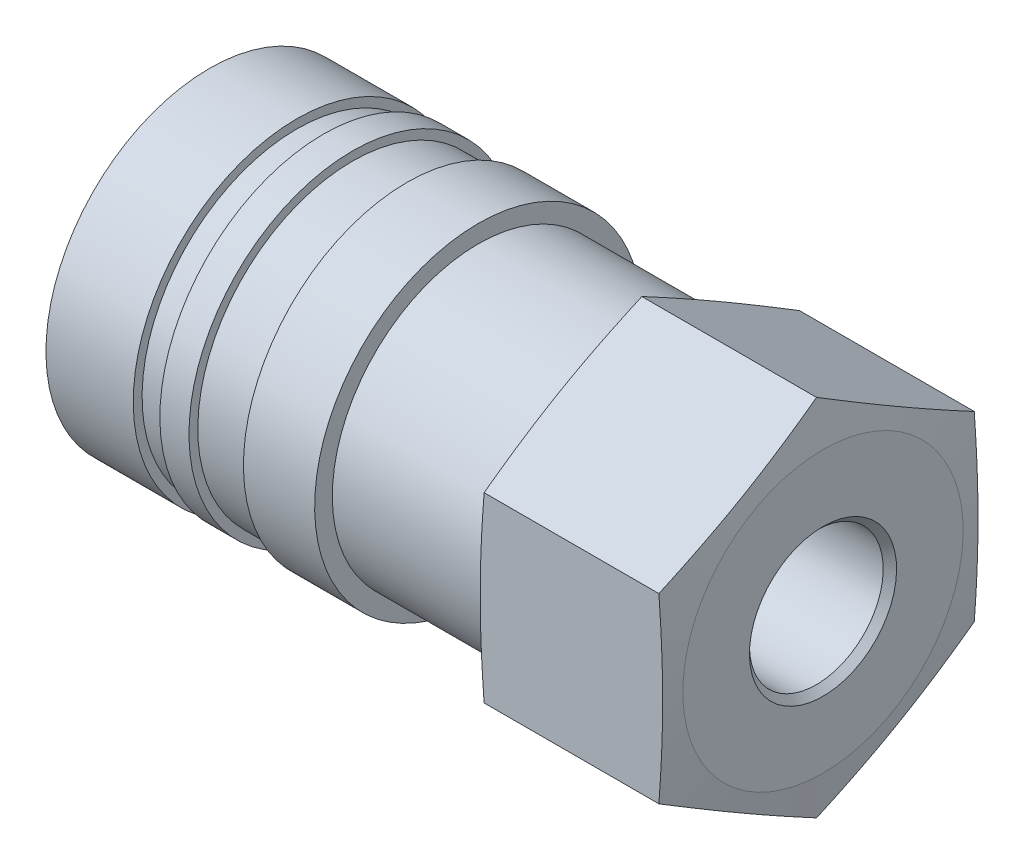
ISO-10303-21;
HEADER;
FILE_DESCRIPTION(('STEP AP214'),'2;1');
FILE_NAME('part.step','',(''),(''),'','','');
FILE_SCHEMA(('AUTOMOTIVE_DESIGN { 1 0 10303 214 1 1 1 1 }'));
ENDSEC;
DATA;
#1=APPLICATION_CONTEXT('core data for automotive mechanical design processes');
#2=APPLICATION_PROTOCOL_DEFINITION('international standard','automotive_design',2000,#1);
#3=PRODUCT_CONTEXT('',#1,'mechanical');
#4=PRODUCT('Part','Part','',(#3));
#5=PRODUCT_RELATED_PRODUCT_CATEGORY('part','',(#4));
#6=PRODUCT_DEFINITION_FORMATION('','',#4);
#7=PRODUCT_DEFINITION_CONTEXT('part definition',#1,'design');
#8=PRODUCT_DEFINITION('design','',#6,#7);
#9=PRODUCT_DEFINITION_SHAPE('','',#8);
#10=(LENGTH_UNIT() NAMED_UNIT(*) SI_UNIT(.MILLI.,.METRE.));
#11=(NAMED_UNIT(*) PLANE_ANGLE_UNIT() SI_UNIT($,.RADIAN.));
#12=(NAMED_UNIT(*) SI_UNIT($,.STERADIAN.) SOLID_ANGLE_UNIT());
#13=UNCERTAINTY_MEASURE_WITH_UNIT(LENGTH_MEASURE(1.E-05),#10,'distance_accuracy_value','');
#14=(GEOMETRIC_REPRESENTATION_CONTEXT(3) GLOBAL_UNCERTAINTY_ASSIGNED_CONTEXT((#13)) GLOBAL_UNIT_ASSIGNED_CONTEXT((#10,
#11,#12)) REPRESENTATION_CONTEXT('',''));
#15=CARTESIAN_POINT('',(0.,0.,0.));
#16=DIRECTION('',(0.,0.,1.));
#17=DIRECTION('',(1.,0.,0.));
#18=AXIS2_PLACEMENT_3D('',#15,#16,#17);
#19=CARTESIAN_POINT('',(55.,11.6913429510899,6.75));
#20=DIRECTION('',(0.,0.866025403784439,0.5));
#21=DIRECTION('',(0.,0.5,-0.866025403784439));
#22=AXIS2_PLACEMENT_3D('',#19,#20,#21);
#23=PLANE('',#22);
#24=CARTESIAN_POINT('',(37.683,6.69159295734021,15.4098210143166));
#25=CARTESIAN_POINT('',(36.7319841472304,11.6913429510899,6.75));
#26=CARTESIAN_POINT('',(37.683,16.6910929448396,-1.90982101431667));
#27=(BOUNDED_CURVE() B_SPLINE_CURVE(2,(#24,#25,#26),.UNSPECIFIED.,.F.,
.F.) B_SPLINE_CURVE_WITH_KNOTS((3,3),(0.,20.0267861610921),
.UNSPECIFIED.) CURVE() GEOMETRIC_REPRESENTATION_ITEM() RATIONAL_B_SPLINE_CURVE((1.,
1.24444444444444,1.)) REPRESENTATION_ITEM(''));
#28=CARTESIAN_POINT('',(37.4894116553188,7.79422863405995,13.5));
#29=VERTEX_POINT('',#28);
#30=CARTESIAN_POINT('',(37.4894116553188,15.5884572681199,0.));
#31=VERTEX_POINT('',#30);
#32=EDGE_CURVE('E35',#29,#31,#27,.T.);
#33=ORIENTED_EDGE('',*,*,#32,.F.);
#34=DIRECTION('',(-1.,0.,0.));
#35=VECTOR('',#34,1.);
#36=CARTESIAN_POINT('',(55.,7.79422863405995,13.5));
#37=LINE('',#36,#35);
#38=CARTESIAN_POINT('',(52.4452063113401,7.79422863405995,13.5));
#39=VERTEX_POINT('',#38);
#40=EDGE_CURVE('E193',#39,#29,#37,.T.);
#41=ORIENTED_EDGE('',*,*,#40,.F.);
#42=CARTESIAN_POINT('',(52.258,16.6910929448396,-1.90982101431667));
#43=CARTESIAN_POINT('',(53.1776636817992,11.6913429510899,6.75));
#44=CARTESIAN_POINT('',(52.258,6.69159295734021,15.4098210143166));
#45=(BOUNDED_CURVE() B_SPLINE_CURVE(2,(#42,#43,#44),.UNSPECIFIED.,.F.,
.F.) B_SPLINE_CURVE_WITH_KNOTS((3,3),(0.,20.0249854726362),
.UNSPECIFIED.) CURVE() GEOMETRIC_REPRESENTATION_ITEM() RATIONAL_B_SPLINE_CURVE((1.,
1.24444444444447,1.)) REPRESENTATION_ITEM(''));
#46=CARTESIAN_POINT('',(52.4452063113401,15.5884572681199,0.));
#47=VERTEX_POINT('',#46);
#48=EDGE_CURVE('E128',#47,#39,#45,.T.);
#49=ORIENTED_EDGE('',*,*,#48,.F.);
#50=DIRECTION('',(-1.,0.,0.));
#51=VECTOR('',#50,1.);
#52=CARTESIAN_POINT('',(55.,15.5884572681199,0.));
#53=LINE('',#52,#51);
#54=EDGE_CURVE('E9',#47,#31,#53,.T.);
#55=ORIENTED_EDGE('',*,*,#54,.T.);
#56=EDGE_LOOP('',(#33,#41,#49,#55));
#57=FACE_BOUND('',#56,.T.);
#58=ADVANCED_FACE('F15',(#57),#23,.T.);
#59=CARTESIAN_POINT('',(55.,11.6913429510899,-6.75));
#60=DIRECTION('',(0.,0.866025403784439,-0.5));
#61=DIRECTION('',(0.,-0.5,-0.866025403784439));
#62=AXIS2_PLACEMENT_3D('',#59,#60,#61);
#63=PLANE('',#62);
#64=CARTESIAN_POINT('',(37.683,16.6910929448396,1.90982101431668));
#65=CARTESIAN_POINT('',(36.7319841472304,11.6913429510899,-6.75));
#66=CARTESIAN_POINT('',(37.683,6.69159295734022,-15.4098210143166));
#67=(BOUNDED_CURVE() B_SPLINE_CURVE(2,(#64,#65,#66),.UNSPECIFIED.,.F.,
.F.) B_SPLINE_CURVE_WITH_KNOTS((3,3),(0.,20.0267861610921),
.UNSPECIFIED.) CURVE() GEOMETRIC_REPRESENTATION_ITEM() RATIONAL_B_SPLINE_CURVE((1.,
1.24444444444444,1.)) REPRESENTATION_ITEM(''));
#68=CARTESIAN_POINT('',(37.4894116553188,7.79422863405995,-13.5));
#69=VERTEX_POINT('',#68);
#70=EDGE_CURVE('E154',#31,#69,#67,.T.);
#71=ORIENTED_EDGE('',*,*,#70,.F.);
#72=ORIENTED_EDGE('',*,*,#54,.F.);
#73=CARTESIAN_POINT('',(52.258,6.69159295734021,-15.4098210143166));
#74=CARTESIAN_POINT('',(53.1776636817993,11.6913429510899,-6.74999999999998));
#75=CARTESIAN_POINT('',(52.258,16.6910929448396,1.90982101431668));
#76=(BOUNDED_CURVE() B_SPLINE_CURVE(2,(#73,#74,#75),.UNSPECIFIED.,.F.,
.F.) B_SPLINE_CURVE_WITH_KNOTS((3,3),(0.,20.0249854726362),
.UNSPECIFIED.) CURVE() GEOMETRIC_REPRESENTATION_ITEM() RATIONAL_B_SPLINE_CURVE((1.,
1.24444444444445,1.)) REPRESENTATION_ITEM(''));
#77=CARTESIAN_POINT('',(52.4452063113401,7.79422863405995,-13.5));
#78=VERTEX_POINT('',#77);
#79=EDGE_CURVE('E165',#78,#47,#76,.T.);
#80=ORIENTED_EDGE('',*,*,#79,.F.);
#81=DIRECTION('',(-1.,0.,0.));
#82=VECTOR('',#81,1.);
#83=CARTESIAN_POINT('',(55.,7.79422863405995,-13.5));
#84=LINE('',#83,#82);
#85=EDGE_CURVE('E27',#78,#69,#84,.T.);
#86=ORIENTED_EDGE('',*,*,#85,.T.);
#87=EDGE_LOOP('',(#71,#72,#80,#86));
#88=FACE_BOUND('',#87,.T.);
#89=ADVANCED_FACE('F272',(#88),#63,.T.);
#90=CARTESIAN_POINT('',(55.,0.,-13.5));
#91=DIRECTION('',(0.,0.,-1.));
#92=DIRECTION('',(0.,-1.,0.));
#93=AXIS2_PLACEMENT_3D('',#90,#91,#92);
#94=PLANE('',#93);
#95=CARTESIAN_POINT('',(37.683,9.99949998749941,-13.5));
#96=CARTESIAN_POINT('',(36.7319841472304,0.,-13.5));
#97=CARTESIAN_POINT('',(37.683,-9.99949998749941,-13.5));
#98=(BOUNDED_CURVE() B_SPLINE_CURVE(2,(#95,#96,#97),.UNSPECIFIED.,.F.,
.F.) B_SPLINE_CURVE_WITH_KNOTS((3,3),(0.,20.0267861610921),
.UNSPECIFIED.) CURVE() GEOMETRIC_REPRESENTATION_ITEM() RATIONAL_B_SPLINE_CURVE((1.,
1.24444444444444,1.)) REPRESENTATION_ITEM(''));
#99=CARTESIAN_POINT('',(37.4894116553188,-7.79422863405994,-13.5));
#100=VERTEX_POINT('',#99);
#101=EDGE_CURVE('E203',#69,#100,#98,.T.);
#102=ORIENTED_EDGE('',*,*,#101,.F.);
#103=ORIENTED_EDGE('',*,*,#85,.F.);
#104=CARTESIAN_POINT('',(52.258,-9.99949998749942,-13.5));
#105=CARTESIAN_POINT('',(53.1776636817993,0.,-13.5));
#106=CARTESIAN_POINT('',(52.258,9.99949998749942,-13.5));
#107=(BOUNDED_CURVE() B_SPLINE_CURVE(2,(#104,#105,#106),.UNSPECIFIED.,.F.,
.F.) B_SPLINE_CURVE_WITH_KNOTS((3,3),(0.,20.0249854726362),
.UNSPECIFIED.) CURVE() GEOMETRIC_REPRESENTATION_ITEM() RATIONAL_B_SPLINE_CURVE((1.,
1.24444444444445,1.)) REPRESENTATION_ITEM(''));
#108=CARTESIAN_POINT('',(52.4452063113401,-7.79422863405994,-13.5));
#109=VERTEX_POINT('',#108);
#110=EDGE_CURVE('E109',#109,#78,#107,.T.);
#111=ORIENTED_EDGE('',*,*,#110,.F.);
#112=DIRECTION('',(-1.,0.,0.));
#113=VECTOR('',#112,1.);
#114=CARTESIAN_POINT('',(55.,-7.79422863405994,-13.5));
#115=LINE('',#114,#113);
#116=EDGE_CURVE('E104',#109,#100,#115,.T.);
#117=ORIENTED_EDGE('',*,*,#116,.T.);
#118=EDGE_LOOP('',(#102,#103,#111,#117));
#119=FACE_BOUND('',#118,.T.);
#120=ADVANCED_FACE('F269',(#119),#94,.T.);
#121=CARTESIAN_POINT('',(55.,-11.6913429510899,-6.75));
#122=DIRECTION('',(0.,-0.866025403784439,-0.5));
#123=DIRECTION('',(0.,-0.5,0.866025403784439));
#124=AXIS2_PLACEMENT_3D('',#121,#122,#123);
#125=PLANE('',#124);
#126=CARTESIAN_POINT('',(37.683,-6.6915929573402,-15.4098210143167));
#127=CARTESIAN_POINT('',(36.7319841472304,-11.6913429510899,-6.75));
#128=CARTESIAN_POINT('',(37.683,-16.6910929448396,1.90982101431667));
#129=(BOUNDED_CURVE() B_SPLINE_CURVE(2,(#126,#127,#128),.UNSPECIFIED.,.F.,
.F.) B_SPLINE_CURVE_WITH_KNOTS((3,3),(0.,20.0267861610922),
.UNSPECIFIED.) CURVE() GEOMETRIC_REPRESENTATION_ITEM() RATIONAL_B_SPLINE_CURVE((1.,
1.24444444444444,1.)) REPRESENTATION_ITEM(''));
#130=CARTESIAN_POINT('',(37.4894116553188,-15.5884572681199,0.));
#131=VERTEX_POINT('',#130);
#132=EDGE_CURVE('E147',#100,#131,#129,.T.);
#133=ORIENTED_EDGE('',*,*,#132,.F.);
#134=ORIENTED_EDGE('',*,*,#116,.F.);
#135=CARTESIAN_POINT('',(52.258,-16.6910929448396,1.90982101431667));
#136=CARTESIAN_POINT('',(53.1776636817993,-11.6913429510899,-6.74999999999998));
#137=CARTESIAN_POINT('',(52.258,-6.6915929573402,-15.4098210143167));
#138=(BOUNDED_CURVE() B_SPLINE_CURVE(2,(#135,#136,#137),.UNSPECIFIED.,.F.,
.F.) B_SPLINE_CURVE_WITH_KNOTS((3,3),(0.,20.0249854726362),
.UNSPECIFIED.) CURVE() GEOMETRIC_REPRESENTATION_ITEM() RATIONAL_B_SPLINE_CURVE((1.,
1.24444444444445,1.)) REPRESENTATION_ITEM(''));
#139=CARTESIAN_POINT('',(52.4452063113401,-15.5884572681199,0.));
#140=VERTEX_POINT('',#139);
#141=EDGE_CURVE('E97',#140,#109,#138,.T.);
#142=ORIENTED_EDGE('',*,*,#141,.F.);
#143=DIRECTION('',(-1.,0.,0.));
#144=VECTOR('',#143,1.);
#145=CARTESIAN_POINT('',(55.,-15.5884572681199,0.));
#146=LINE('',#145,#144);
#147=EDGE_CURVE('E101',#140,#131,#146,.T.);
#148=ORIENTED_EDGE('',*,*,#147,.T.);
#149=EDGE_LOOP('',(#133,#134,#142,#148));
#150=FACE_BOUND('',#149,.T.);
#151=ADVANCED_FACE('F100',(#150),#125,.T.);
#152=CARTESIAN_POINT('',(55.,-11.6913429510899,6.75));
#153=DIRECTION('',(0.,-0.866025403784439,0.5));
#154=DIRECTION('',(0.,0.5,0.866025403784439));
#155=AXIS2_PLACEMENT_3D('',#152,#153,#154);
#156=PLANE('',#155);
#157=CARTESIAN_POINT('',(37.683,-16.6910929448396,-1.90982101431668));
#158=CARTESIAN_POINT('',(36.7319841472304,-11.6913429510899,6.75));
#159=CARTESIAN_POINT('',(37.683,-6.69159295734022,15.4098210143166));
#160=(BOUNDED_CURVE() B_SPLINE_CURVE(2,(#157,#158,#159),.UNSPECIFIED.,.F.,
.F.) B_SPLINE_CURVE_WITH_KNOTS((3,3),(0.,20.0267861610921),
.UNSPECIFIED.) CURVE() GEOMETRIC_REPRESENTATION_ITEM() RATIONAL_B_SPLINE_CURVE((1.,
1.24444444444444,1.)) REPRESENTATION_ITEM(''));
#161=CARTESIAN_POINT('',(37.4894116553188,-7.79422863405996,13.5));
#162=VERTEX_POINT('',#161);
#163=EDGE_CURVE('E118',#131,#162,#160,.T.);
#164=ORIENTED_EDGE('',*,*,#163,.F.);
#165=ORIENTED_EDGE('',*,*,#147,.F.);
#166=CARTESIAN_POINT('',(52.258,-6.69159295734022,15.4098210143166));
#167=CARTESIAN_POINT('',(53.1776636817992,-11.6913429510899,6.74999999999999));
#168=CARTESIAN_POINT('',(52.258,-16.6910929448396,-1.90982101431668));
#169=(BOUNDED_CURVE() B_SPLINE_CURVE(2,(#166,#167,#168),.UNSPECIFIED.,.F.,
.F.) B_SPLINE_CURVE_WITH_KNOTS((3,3),(0.,20.0249854726362),
.UNSPECIFIED.) CURVE() GEOMETRIC_REPRESENTATION_ITEM() RATIONAL_B_SPLINE_CURVE((1.,
1.24444444444447,1.)) REPRESENTATION_ITEM(''));
#170=CARTESIAN_POINT('',(52.4452063113401,-7.79422863405996,13.5));
#171=VERTEX_POINT('',#170);
#172=EDGE_CURVE('E115',#171,#140,#169,.T.);
#173=ORIENTED_EDGE('',*,*,#172,.F.);
#174=DIRECTION('',(-1.,0.,0.));
#175=VECTOR('',#174,1.);
#176=CARTESIAN_POINT('',(55.,-7.79422863405996,13.5));
#177=LINE('',#176,#175);
#178=EDGE_CURVE('E119',#171,#162,#177,.T.);
#179=ORIENTED_EDGE('',*,*,#178,.T.);
#180=EDGE_LOOP('',(#164,#165,#173,#179));
#181=FACE_BOUND('',#180,.T.);
#182=ADVANCED_FACE('F113',(#181),#156,.T.);
#183=CARTESIAN_POINT('',(55.,0.,13.5));
#184=DIRECTION('',(0.,0.,1.));
#185=DIRECTION('',(0.,1.,0.));
#186=AXIS2_PLACEMENT_3D('',#183,#184,#185);
#187=PLANE('',#186);
#188=CARTESIAN_POINT('',(37.683,-9.99949998749942,13.5));
#189=CARTESIAN_POINT('',(36.7319841472304,0.,13.5));
#190=CARTESIAN_POINT('',(37.683,9.99949998749942,13.5));
#191=(BOUNDED_CURVE() B_SPLINE_CURVE(2,(#188,#189,#190),.UNSPECIFIED.,.F.,
.F.) B_SPLINE_CURVE_WITH_KNOTS((3,3),(0.,20.0267861610922),
.UNSPECIFIED.) CURVE() GEOMETRIC_REPRESENTATION_ITEM() RATIONAL_B_SPLINE_CURVE((1.,
1.24444444444444,1.)) REPRESENTATION_ITEM(''));
#192=EDGE_CURVE('E19',#162,#29,#191,.T.);
#193=ORIENTED_EDGE('',*,*,#192,.F.);
#194=ORIENTED_EDGE('',*,*,#178,.F.);
#195=CARTESIAN_POINT('',(52.258,9.99949998749942,13.5));
#196=CARTESIAN_POINT('',(53.1776636817992,0.,13.5));
#197=CARTESIAN_POINT('',(52.258,-9.99949998749942,13.5));
#198=(BOUNDED_CURVE() B_SPLINE_CURVE(2,(#195,#196,#197),.UNSPECIFIED.,.F.,
.F.) B_SPLINE_CURVE_WITH_KNOTS((3,3),(0.,20.0249854726362),
.UNSPECIFIED.) CURVE() GEOMETRIC_REPRESENTATION_ITEM() RATIONAL_B_SPLINE_CURVE((1.,
1.24444444444447,1.)) REPRESENTATION_ITEM(''));
#199=EDGE_CURVE('E125',#39,#171,#198,.T.);
#200=ORIENTED_EDGE('',*,*,#199,.F.);
#201=ORIENTED_EDGE('',*,*,#40,.T.);
#202=EDGE_LOOP('',(#193,#194,#200,#201));
#203=FACE_BOUND('',#202,.T.);
#204=ADVANCED_FACE('F302',(#203),#187,.T.);
#205=CARTESIAN_POINT('',(52.71375,0.,0.));
#206=DIRECTION('',(1.,0.,0.));
#207=DIRECTION('',(0.,1.,0.));
#208=AXIS2_PLACEMENT_3D('',#205,#206,#207);
#209=CONICAL_SURFACE('',#208,6.01125,0.785398163397448);
#210=CARTESIAN_POINT('',(52.4275,0.,0.));
#211=DIRECTION('',(1.,0.,0.));
#212=DIRECTION('',(0.,0.,1.));
#213=AXIS2_PLACEMENT_3D('',#210,#211,#212);
#214=CIRCLE('',#213,5.725);
#215=CARTESIAN_POINT('',(52.4275,5.725,0.));
#216=VERTEX_POINT('',#215);
#217=EDGE_CURVE('E182',#216,#216,#214,.T.);
#218=ORIENTED_EDGE('',*,*,#217,.F.);
#219=EDGE_LOOP('',(#218));
#220=FACE_BOUND('',#219,.T.);
#221=CARTESIAN_POINT('',(53.,0.,0.));
#222=DIRECTION('',(-1.,0.,0.));
#223=DIRECTION('',(0.,1.,0.));
#224=AXIS2_PLACEMENT_3D('',#221,#222,#223);
#225=CIRCLE('',#224,6.2975);
#226=CARTESIAN_POINT('',(53.,6.2975,0.));
#227=VERTEX_POINT('',#226);
#228=EDGE_CURVE('E126',#227,#227,#225,.T.);
#229=ORIENTED_EDGE('',*,*,#228,.F.);
#230=EDGE_LOOP('',(#229));
#231=FACE_BOUND('',#230,.T.);
#232=ADVANCED_FACE('F304',(#220,#231),#209,.F.);
#233=CARTESIAN_POINT('',(0.35,0.,0.));
#234=DIRECTION('',(-1.,0.,0.));
#235=DIRECTION('',(0.,1.,0.));
#236=AXIS2_PLACEMENT_3D('',#233,#234,#235);
#237=CONICAL_SURFACE('',#236,10.15,0.785398163397448);
#238=CARTESIAN_POINT('',(0.7,0.,0.));
#239=DIRECTION('',(-1.,0.,0.));
#240=DIRECTION('',(0.,0.,-1.));
#241=AXIS2_PLACEMENT_3D('',#238,#239,#240);
#242=CIRCLE('',#241,9.8);
#243=CARTESIAN_POINT('',(0.7,9.8,0.));
#244=VERTEX_POINT('',#243);
#245=EDGE_CURVE('E190',#244,#244,#242,.T.);
#246=ORIENTED_EDGE('',*,*,#245,.F.);
#247=EDGE_LOOP('',(#246));
#248=FACE_BOUND('',#247,.T.);
#249=CARTESIAN_POINT('',(0.,0.,0.));
#250=DIRECTION('',(1.,0.,0.));
#251=DIRECTION('',(0.,1.,0.));
#252=AXIS2_PLACEMENT_3D('',#249,#250,#251);
#253=CIRCLE('',#252,10.5);
#254=CARTESIAN_POINT('',(0.,10.5,0.));
#255=VERTEX_POINT('',#254);
#256=EDGE_CURVE('E142',#255,#255,#253,.T.);
#257=ORIENTED_EDGE('',*,*,#256,.F.);
#258=EDGE_LOOP('',(#257));
#259=FACE_BOUND('',#258,.T.);
#260=ADVANCED_FACE('F17',(#248,#259),#237,.F.);
#261=CARTESIAN_POINT('',(6.125,0.,0.));
#262=DIRECTION('',(-1.,0.,0.));
#263=DIRECTION('',(0.,0.,-1.));
#264=AXIS2_PLACEMENT_3D('',#261,#262,#263);
#265=CYLINDRICAL_SURFACE('',#264,9.8);
#266=ORIENTED_EDGE('',*,*,#245,.T.);
#267=EDGE_LOOP('',(#266));
#268=FACE_BOUND('',#267,.T.);
#269=CARTESIAN_POINT('',(13.25,0.,0.));
#270=DIRECTION('',(1.,0.,0.));
#271=DIRECTION('',(0.,0.,-1.));
#272=AXIS2_PLACEMENT_3D('',#269,#270,#271);
#273=CIRCLE('',#272,9.8);
#274=CARTESIAN_POINT('',(13.25,0.,-9.8));
#275=VERTEX_POINT('',#274);
#276=EDGE_CURVE('E188',#275,#275,#273,.T.);
#277=ORIENTED_EDGE('',*,*,#276,.T.);
#278=EDGE_LOOP('',(#277));
#279=FACE_BOUND('',#278,.T.);
#280=ADVANCED_FACE('F381',(#268,#279),#265,.F.);
#281=CARTESIAN_POINT('',(13.25,0.,0.));
#282=DIRECTION('',(1.,0.,0.));
#283=DIRECTION('',(0.,0.,-1.));
#284=AXIS2_PLACEMENT_3D('',#281,#282,#283);
#285=PLANE('',#284);
#286=ORIENTED_EDGE('',*,*,#276,.F.);
#287=EDGE_LOOP('',(#286));
#288=FACE_BOUND('',#287,.T.);
#289=ADVANCED_FACE('F386',(#288),#285,.F.);
#290=CARTESIAN_POINT('',(45.55,0.,0.));
#291=DIRECTION('',(1.,0.,0.));
#292=DIRECTION('',(0.,0.,1.));
#293=AXIS2_PLACEMENT_3D('',#290,#291,#292);
#294=CYLINDRICAL_SURFACE('',#293,5.725);
#295=ORIENTED_EDGE('',*,*,#217,.T.);
#296=EDGE_LOOP('',(#295));
#297=FACE_BOUND('',#296,.T.);
#298=CARTESIAN_POINT('',(37.1,0.,0.));
#299=DIRECTION('',(-1.,0.,0.));
#300=DIRECTION('',(0.,0.,1.));
#301=AXIS2_PLACEMENT_3D('',#298,#299,#300);
#302=CIRCLE('',#301,5.725);
#303=CARTESIAN_POINT('',(37.1,0.,5.725));
#304=VERTEX_POINT('',#303);
#305=EDGE_CURVE('E189',#304,#304,#302,.T.);
#306=ORIENTED_EDGE('',*,*,#305,.T.);
#307=EDGE_LOOP('',(#306));
#308=FACE_BOUND('',#307,.T.);
#309=ADVANCED_FACE('F392',(#297,#308),#294,.F.);
#310=CARTESIAN_POINT('',(37.1,0.,0.));
#311=DIRECTION('',(-1.,0.,0.));
#312=DIRECTION('',(0.,0.,1.));
#313=AXIS2_PLACEMENT_3D('',#310,#311,#312);
#314=PLANE('',#313);
#315=ORIENTED_EDGE('',*,*,#305,.F.);
#316=EDGE_LOOP('',(#315));
#317=FACE_BOUND('',#316,.T.);
#318=ADVANCED_FACE('F397',(#317),#314,.F.);
#319=CARTESIAN_POINT('',(15.052,0.,0.));
#320=DIRECTION('',(-1.,0.,0.));
#321=DIRECTION('',(0.,1.,0.));
#322=AXIS2_PLACEMENT_3D('',#319,#320,#321);
#323=CYLINDRICAL_SURFACE('',#322,13.244);
#324=CARTESIAN_POINT('',(17.384,0.,0.));
#325=DIRECTION('',(1.,0.,0.));
#326=DIRECTION('',(0.,1.,0.));
#327=AXIS2_PLACEMENT_3D('',#324,#325,#326);
#328=CIRCLE('',#327,13.244);
#329=CARTESIAN_POINT('',(17.384,13.244,0.));
#330=VERTEX_POINT('',#329);
#331=EDGE_CURVE('E176',#330,#330,#328,.T.);
#332=ORIENTED_EDGE('',*,*,#331,.F.);
#333=EDGE_LOOP('',(#332));
#334=FACE_BOUND('',#333,.T.);
#335=CARTESIAN_POINT('',(12.72,0.,0.));
#336=DIRECTION('',(1.,0.,0.));
#337=DIRECTION('',(0.,1.,0.));
#338=AXIS2_PLACEMENT_3D('',#335,#336,#337);
#339=CIRCLE('',#338,13.244);
#340=CARTESIAN_POINT('',(12.72,13.244,0.));
#341=VERTEX_POINT('',#340);
#342=EDGE_CURVE('E214',#341,#341,#339,.T.);
#343=ORIENTED_EDGE('',*,*,#342,.T.);
#344=EDGE_LOOP('',(#343));
#345=FACE_BOUND('',#344,.T.);
#346=ADVANCED_FACE('F323',(#334,#345),#323,.T.);
#347=CARTESIAN_POINT('',(17.384,13.622,0.));
#348=DIRECTION('',(-1.,0.,0.));
#349=DIRECTION('',(0.,-1.,0.));
#350=AXIS2_PLACEMENT_3D('',#347,#348,#349);
#351=PLANE('',#350);
#352=CARTESIAN_POINT('',(17.384,0.,0.));
#353=DIRECTION('',(1.,0.,0.));
#354=DIRECTION('',(0.,1.,0.));
#355=AXIS2_PLACEMENT_3D('',#352,#353,#354);
#356=CIRCLE('',#355,14.);
#357=CARTESIAN_POINT('',(17.384,14.,0.));
#358=VERTEX_POINT('',#357);
#359=EDGE_CURVE('E170',#358,#358,#356,.T.);
#360=ORIENTED_EDGE('',*,*,#359,.F.);
#361=EDGE_LOOP('',(#360));
#362=FACE_BOUND('',#361,.T.);
#363=ORIENTED_EDGE('',*,*,#331,.T.);
#364=EDGE_LOOP('',(#363));
#365=FACE_BOUND('',#364,.T.);
#366=ADVANCED_FACE('F339',(#362,#365),#351,.T.);
#367=CARTESIAN_POINT('',(20.4315,0.,0.));
#368=DIRECTION('',(-1.,0.,0.));
#369=DIRECTION('',(0.,1.,0.));
#370=AXIS2_PLACEMENT_3D('',#367,#368,#369);
#371=CYLINDRICAL_SURFACE('',#370,14.);
#372=CARTESIAN_POINT('',(23.479,0.,0.));
#373=DIRECTION('',(1.,0.,0.));
#374=DIRECTION('',(0.,1.,0.));
#375=AXIS2_PLACEMENT_3D('',#372,#373,#374);
#376=CIRCLE('',#375,14.);
#377=CARTESIAN_POINT('',(23.479,14.,0.));
#378=VERTEX_POINT('',#377);
#379=EDGE_CURVE('E177',#378,#378,#376,.T.);
#380=ORIENTED_EDGE('',*,*,#379,.F.);
#381=EDGE_LOOP('',(#380));
#382=FACE_BOUND('',#381,.T.);
#383=ORIENTED_EDGE('',*,*,#359,.T.);
#384=EDGE_LOOP('',(#383));
#385=FACE_BOUND('',#384,.T.);
#386=ADVANCED_FACE('F335',(#382,#385),#371,.T.);
#387=CARTESIAN_POINT('',(23.479,13.244,0.));
#388=DIRECTION('',(1.,0.,0.));
#389=DIRECTION('',(0.,1.,0.));
#390=AXIS2_PLACEMENT_3D('',#387,#388,#389);
#391=PLANE('',#390);
#392=CARTESIAN_POINT('',(23.479,0.,0.));
#393=DIRECTION('',(1.,0.,0.));
#394=DIRECTION('',(0.,1.,0.));
#395=AXIS2_PLACEMENT_3D('',#392,#393,#394);
#396=CIRCLE('',#395,12.488);
#397=CARTESIAN_POINT('',(23.479,12.488,0.));
#398=VERTEX_POINT('',#397);
#399=EDGE_CURVE('E181',#398,#398,#396,.T.);
#400=ORIENTED_EDGE('',*,*,#399,.F.);
#401=EDGE_LOOP('',(#400));
#402=FACE_BOUND('',#401,.T.);
#403=ORIENTED_EDGE('',*,*,#379,.T.);
#404=EDGE_LOOP('',(#403));
#405=FACE_BOUND('',#404,.T.);
#406=ADVANCED_FACE('F338',(#402,#405),#391,.T.);
#407=CARTESIAN_POINT('',(30.2365,0.,0.));
#408=DIRECTION('',(-1.,0.,0.));
#409=DIRECTION('',(0.,1.,0.));
#410=AXIS2_PLACEMENT_3D('',#407,#408,#409);
#411=CYLINDRICAL_SURFACE('',#410,12.488);
#412=CARTESIAN_POINT('',(36.994,0.,0.));
#413=DIRECTION('',(1.,0.,0.));
#414=DIRECTION('',(0.,1.,0.));
#415=AXIS2_PLACEMENT_3D('',#412,#413,#414);
#416=CIRCLE('',#415,12.488);
#417=CARTESIAN_POINT('',(36.994,12.488,0.));
#418=VERTEX_POINT('',#417);
#419=EDGE_CURVE('E108',#418,#418,#416,.T.);
#420=ORIENTED_EDGE('',*,*,#419,.F.);
#421=EDGE_LOOP('',(#420));
#422=FACE_BOUND('',#421,.T.);
#423=ORIENTED_EDGE('',*,*,#399,.T.);
#424=EDGE_LOOP('',(#423));
#425=FACE_BOUND('',#424,.T.);
#426=ADVANCED_FACE('F405',(#422,#425),#411,.T.);
#427=CARTESIAN_POINT('',(37.3385,0.,0.));
#428=DIRECTION('',(1.,0.,0.));
#429=DIRECTION('',(0.,1.,0.));
#430=AXIS2_PLACEMENT_3D('',#427,#428,#429);
#431=CONICAL_SURFACE('',#430,14.644,1.41234910397016);
#432=ORIENTED_EDGE('',*,*,#132,.T.);
#433=ORIENTED_EDGE('',*,*,#163,.T.);
#434=ORIENTED_EDGE('',*,*,#192,.T.);
#435=ORIENTED_EDGE('',*,*,#32,.T.);
#436=ORIENTED_EDGE('',*,*,#70,.T.);
#437=ORIENTED_EDGE('',*,*,#101,.T.);
#438=EDGE_LOOP('',(#432,#433,#434,#435,#436,#437));
#439=FACE_BOUND('',#438,.T.);
#440=ORIENTED_EDGE('',*,*,#419,.T.);
#441=EDGE_LOOP('',(#440));
#442=FACE_BOUND('',#441,.T.);
#443=ADVANCED_FACE('F298',(#439,#442),#431,.T.);
#444=CARTESIAN_POINT('',(52.629,0.,0.));
#445=DIRECTION('',(-1.,0.,0.));
#446=DIRECTION('',(0.,1.,0.));
#447=AXIS2_PLACEMENT_3D('',#444,#445,#446);
#448=CONICAL_SURFACE('',#447,14.399,1.41748982434309);
#449=ORIENTED_EDGE('',*,*,#141,.T.);
#450=ORIENTED_EDGE('',*,*,#110,.T.);
#451=ORIENTED_EDGE('',*,*,#79,.T.);
#452=ORIENTED_EDGE('',*,*,#48,.T.);
#453=ORIENTED_EDGE('',*,*,#199,.T.);
#454=ORIENTED_EDGE('',*,*,#172,.T.);
#455=EDGE_LOOP('',(#449,#450,#451,#452,#453,#454));
#456=FACE_BOUND('',#455,.T.);
#457=CARTESIAN_POINT('',(53.,0.,0.));
#458=DIRECTION('',(1.,0.,0.));
#459=DIRECTION('',(0.,1.,0.));
#460=AXIS2_PLACEMENT_3D('',#457,#458,#459);
#461=CIRCLE('',#460,11.998);
#462=CARTESIAN_POINT('',(53.,11.998,0.));
#463=VERTEX_POINT('',#462);
#464=EDGE_CURVE('E131',#463,#463,#461,.T.);
#465=ORIENTED_EDGE('',*,*,#464,.F.);
#466=EDGE_LOOP('',(#465));
#467=FACE_BOUND('',#466,.T.);
#468=ADVANCED_FACE('F122',(#456,#467),#448,.T.);
#469=CARTESIAN_POINT('',(53.,5.999,0.));
#470=DIRECTION('',(1.,0.,0.));
#471=DIRECTION('',(0.,1.,0.));
#472=AXIS2_PLACEMENT_3D('',#469,#470,#471);
#473=PLANE('',#472);
#474=ORIENTED_EDGE('',*,*,#228,.T.);
#475=EDGE_LOOP('',(#474));
#476=FACE_BOUND('',#475,.T.);
#477=ORIENTED_EDGE('',*,*,#464,.T.);
#478=EDGE_LOOP('',(#477));
#479=FACE_BOUND('',#478,.T.);
#480=ADVANCED_FACE('F328',(#476,#479),#473,.T.);
#481=CARTESIAN_POINT('',(0.,6.622,0.));
#482=DIRECTION('',(-1.,0.,0.));
#483=DIRECTION('',(0.,-1.,0.));
#484=AXIS2_PLACEMENT_3D('',#481,#482,#483);
#485=PLANE('',#484);
#486=ORIENTED_EDGE('',*,*,#256,.T.);
#487=EDGE_LOOP('',(#486));
#488=FACE_BOUND('',#487,.T.);
#489=CARTESIAN_POINT('',(0.,0.,0.));
#490=DIRECTION('',(1.,0.,0.));
#491=DIRECTION('',(0.,1.,0.));
#492=AXIS2_PLACEMENT_3D('',#489,#490,#491);
#493=CIRCLE('',#492,13.244);
#494=CARTESIAN_POINT('',(0.,13.244,0.));
#495=VERTEX_POINT('',#494);
#496=EDGE_CURVE('E136',#495,#495,#493,.T.);
#497=ORIENTED_EDGE('',*,*,#496,.F.);
#498=EDGE_LOOP('',(#497));
#499=FACE_BOUND('',#498,.T.);
#500=ADVANCED_FACE('F343',(#488,#499),#485,.T.);
#501=CARTESIAN_POINT('',(0.2385,0.,0.));
#502=DIRECTION('',(1.,0.,0.));
#503=DIRECTION('',(0.,1.,0.));
#504=AXIS2_PLACEMENT_3D('',#501,#502,#503);
#505=CONICAL_SURFACE('',#504,13.622,1.00792809394679);
#506=CARTESIAN_POINT('',(0.477,0.,0.));
#507=DIRECTION('',(1.,0.,0.));
#508=DIRECTION('',(0.,1.,0.));
#509=AXIS2_PLACEMENT_3D('',#506,#507,#508);
#510=CIRCLE('',#509,14.);
#511=CARTESIAN_POINT('',(0.477,14.,0.));
#512=VERTEX_POINT('',#511);
#513=EDGE_CURVE('E143',#512,#512,#510,.T.);
#514=ORIENTED_EDGE('',*,*,#513,.F.);
#515=EDGE_LOOP('',(#514));
#516=FACE_BOUND('',#515,.T.);
#517=ORIENTED_EDGE('',*,*,#496,.T.);
#518=EDGE_LOOP('',(#517));
#519=FACE_BOUND('',#518,.T.);
#520=ADVANCED_FACE('F348',(#516,#519),#505,.T.);
#521=CARTESIAN_POINT('',(4.2135,0.,0.));
#522=DIRECTION('',(-1.,0.,0.));
#523=DIRECTION('',(0.,1.,0.));
#524=AXIS2_PLACEMENT_3D('',#521,#522,#523);
#525=CYLINDRICAL_SURFACE('',#524,14.);
#526=CARTESIAN_POINT('',(7.95,0.,0.));
#527=DIRECTION('',(1.,0.,0.));
#528=DIRECTION('',(0.,1.,0.));
#529=AXIS2_PLACEMENT_3D('',#526,#527,#528);
#530=CIRCLE('',#529,14.);
#531=CARTESIAN_POINT('',(7.95,14.,0.));
#532=VERTEX_POINT('',#531);
#533=EDGE_CURVE('E163',#532,#532,#530,.T.);
#534=ORIENTED_EDGE('',*,*,#533,.F.);
#535=EDGE_LOOP('',(#534));
#536=FACE_BOUND('',#535,.T.);
#537=ORIENTED_EDGE('',*,*,#513,.T.);
#538=EDGE_LOOP('',(#537));
#539=FACE_BOUND('',#538,.T.);
#540=ADVANCED_FACE('F333',(#536,#539),#525,.T.);
#541=CARTESIAN_POINT('',(7.95,13.622,0.));
#542=DIRECTION('',(1.,0.,0.));
#543=DIRECTION('',(0.,1.,0.));
#544=AXIS2_PLACEMENT_3D('',#541,#542,#543);
#545=PLANE('',#544);
#546=CARTESIAN_POINT('',(7.95,0.,0.));
#547=DIRECTION('',(1.,0.,0.));
#548=DIRECTION('',(0.,1.,0.));
#549=AXIS2_PLACEMENT_3D('',#546,#547,#548);
#550=CIRCLE('',#549,13.244);
#551=CARTESIAN_POINT('',(7.95,13.244,0.));
#552=VERTEX_POINT('',#551);
#553=EDGE_CURVE('E160',#552,#552,#550,.T.);
#554=ORIENTED_EDGE('',*,*,#553,.F.);
#555=EDGE_LOOP('',(#554));
#556=FACE_BOUND('',#555,.T.);
#557=ORIENTED_EDGE('',*,*,#533,.T.);
#558=EDGE_LOOP('',(#557));
#559=FACE_BOUND('',#558,.T.);
#560=ADVANCED_FACE('F329',(#556,#559),#545,.T.);
#561=CARTESIAN_POINT('',(9.0895,0.,0.));
#562=DIRECTION('',(-1.,0.,0.));
#563=DIRECTION('',(0.,1.,0.));
#564=AXIS2_PLACEMENT_3D('',#561,#562,#563);
#565=CYLINDRICAL_SURFACE('',#564,13.244);
#566=CARTESIAN_POINT('',(10.229,0.,0.));
#567=DIRECTION('',(1.,0.,0.));
#568=DIRECTION('',(0.,1.,0.));
#569=AXIS2_PLACEMENT_3D('',#566,#567,#568);
#570=CIRCLE('',#569,13.244);
#571=CARTESIAN_POINT('',(10.229,13.244,0.));
#572=VERTEX_POINT('',#571);
#573=EDGE_CURVE('E164',#572,#572,#570,.T.);
#574=ORIENTED_EDGE('',*,*,#573,.F.);
#575=EDGE_LOOP('',(#574));
#576=FACE_BOUND('',#575,.T.);
#577=ORIENTED_EDGE('',*,*,#553,.T.);
#578=EDGE_LOOP('',(#577));
#579=FACE_BOUND('',#578,.T.);
#580=ADVANCED_FACE('F332',(#576,#579),#565,.T.);
#581=CARTESIAN_POINT('',(10.229,13.622,0.));
#582=DIRECTION('',(-1.,0.,0.));
#583=DIRECTION('',(0.,-1.,0.));
#584=AXIS2_PLACEMENT_3D('',#581,#582,#583);
#585=PLANE('',#584);
#586=CARTESIAN_POINT('',(10.229,0.,0.));
#587=DIRECTION('',(1.,0.,0.));
#588=DIRECTION('',(0.,1.,0.));
#589=AXIS2_PLACEMENT_3D('',#586,#587,#588);
#590=CIRCLE('',#589,14.);
#591=CARTESIAN_POINT('',(10.229,14.,0.));
#592=VERTEX_POINT('',#591);
#593=EDGE_CURVE('E198',#592,#592,#590,.T.);
#594=ORIENTED_EDGE('',*,*,#593,.F.);
#595=EDGE_LOOP('',(#594));
#596=FACE_BOUND('',#595,.T.);
#597=ORIENTED_EDGE('',*,*,#573,.T.);
#598=EDGE_LOOP('',(#597));
#599=FACE_BOUND('',#598,.T.);
#600=ADVANCED_FACE('F353',(#596,#599),#585,.T.);
#601=CARTESIAN_POINT('',(11.4745,0.,0.));
#602=DIRECTION('',(-1.,0.,0.));
#603=DIRECTION('',(0.,1.,0.));
#604=AXIS2_PLACEMENT_3D('',#601,#602,#603);
#605=CYLINDRICAL_SURFACE('',#604,14.);
#606=CARTESIAN_POINT('',(12.72,0.,0.));
#607=DIRECTION('',(1.,0.,0.));
#608=DIRECTION('',(0.,1.,0.));
#609=AXIS2_PLACEMENT_3D('',#606,#607,#608);
#610=CIRCLE('',#609,14.);
#611=CARTESIAN_POINT('',(12.72,14.,0.));
#612=VERTEX_POINT('',#611);
#613=EDGE_CURVE('E209',#612,#612,#610,.T.);
#614=ORIENTED_EDGE('',*,*,#613,.F.);
#615=EDGE_LOOP('',(#614));
#616=FACE_BOUND('',#615,.T.);
#617=ORIENTED_EDGE('',*,*,#593,.T.);
#618=EDGE_LOOP('',(#617));
#619=FACE_BOUND('',#618,.T.);
#620=ADVANCED_FACE('F350',(#616,#619),#605,.T.);
#621=CARTESIAN_POINT('',(12.72,13.622,0.));
#622=DIRECTION('',(1.,0.,0.));
#623=DIRECTION('',(0.,1.,0.));
#624=AXIS2_PLACEMENT_3D('',#621,#622,#623);
#625=PLANE('',#624);
#626=ORIENTED_EDGE('',*,*,#342,.F.);
#627=EDGE_LOOP('',(#626));
#628=FACE_BOUND('',#627,.T.);
#629=ORIENTED_EDGE('',*,*,#613,.T.);
#630=EDGE_LOOP('',(#629));
#631=FACE_BOUND('',#630,.T.);
#632=ADVANCED_FACE('F352',(#628,#631),#625,.T.);
#633=CLOSED_SHELL('',(#58,#89,#120,#151,#182,#204,#232,#260,#280,#289,#309,#318,#346,#366,#386,
#406,#426,#443,#468,#480,#500,#520,#540,#560,#580,#600,#620,#632));
#634=MANIFOLD_SOLID_BREP('B1',#633);
#635=ADVANCED_BREP_SHAPE_REPRESENTATION('',(#18,#634),#14);
#636=SHAPE_DEFINITION_REPRESENTATION(#9,#635);
ENDSEC;
END-ISO-10303-21;
